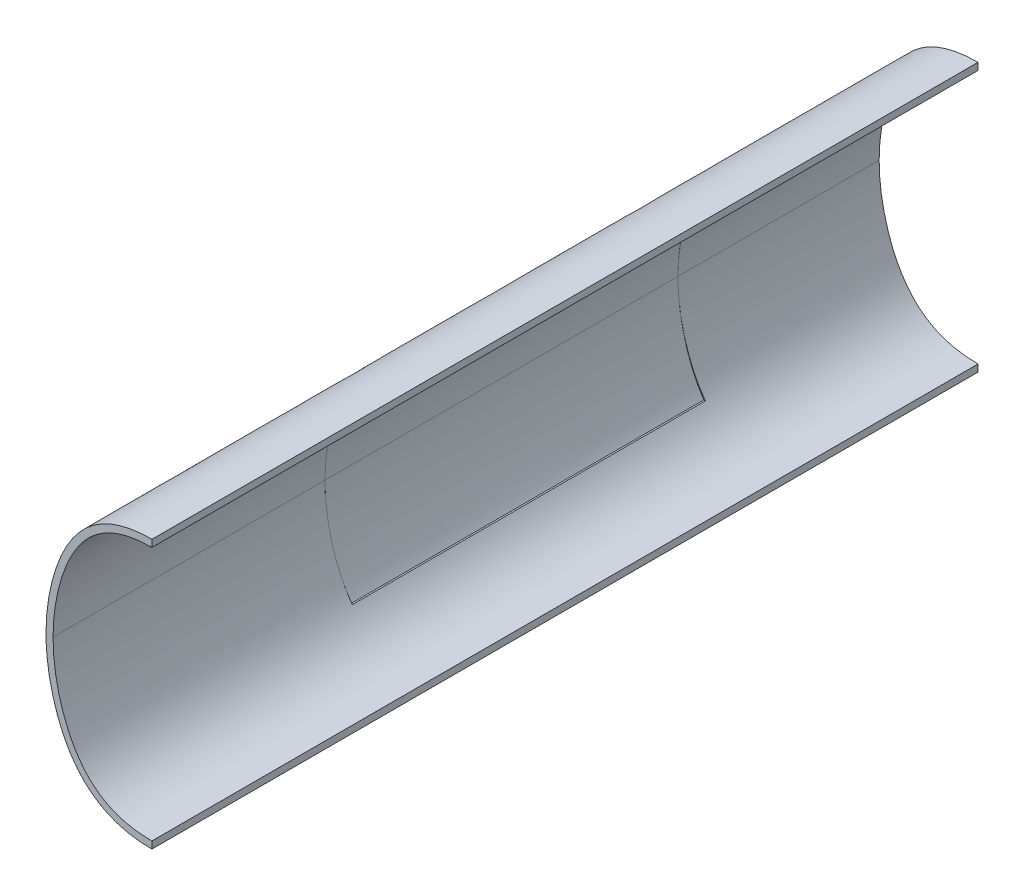
ISO-10303-21;
HEADER;
FILE_DESCRIPTION(('STEP AP214'),'2;1');
FILE_NAME('part.step','',(''),(''),'','','');
FILE_SCHEMA(('AUTOMOTIVE_DESIGN { 1 0 10303 214 1 1 1 1 }'));
ENDSEC;
DATA;
#1=APPLICATION_CONTEXT('core data for automotive mechanical design processes');
#2=APPLICATION_PROTOCOL_DEFINITION('international standard','automotive_design',2000,#1);
#3=PRODUCT_CONTEXT('',#1,'mechanical');
#4=PRODUCT('Part','Part','',(#3));
#5=PRODUCT_RELATED_PRODUCT_CATEGORY('part','',(#4));
#6=PRODUCT_DEFINITION_FORMATION('','',#4);
#7=PRODUCT_DEFINITION_CONTEXT('part definition',#1,'design');
#8=PRODUCT_DEFINITION('design','',#6,#7);
#9=PRODUCT_DEFINITION_SHAPE('','',#8);
#10=(LENGTH_UNIT() NAMED_UNIT(*) SI_UNIT(.MILLI.,.METRE.));
#11=(NAMED_UNIT(*) PLANE_ANGLE_UNIT() SI_UNIT($,.RADIAN.));
#12=(NAMED_UNIT(*) SI_UNIT($,.STERADIAN.) SOLID_ANGLE_UNIT());
#13=UNCERTAINTY_MEASURE_WITH_UNIT(LENGTH_MEASURE(1.E-05),#10,'distance_accuracy_value','');
#14=(GEOMETRIC_REPRESENTATION_CONTEXT(3) GLOBAL_UNCERTAINTY_ASSIGNED_CONTEXT((#13)) GLOBAL_UNIT_ASSIGNED_CONTEXT((#10,
#11,#12)) REPRESENTATION_CONTEXT('',''));
#15=CARTESIAN_POINT('',(0.,0.,0.));
#16=DIRECTION('',(0.,0.,1.));
#17=DIRECTION('',(1.,0.,0.));
#18=AXIS2_PLACEMENT_3D('',#15,#16,#17);
#19=CARTESIAN_POINT('',(-125.,0.,140.));
#20=CARTESIAN_POINT('',(-125.,20.4980083685293,140.));
#21=CARTESIAN_POINT('',(-118.023084898436,36.9930136098683,140.));
#22=CARTESIAN_POINT('',(-110.715171183919,57.,140.));
#23=CARTESIAN_POINT('',(-80.,57.,140.));
#24=B_SPLINE_CURVE_WITH_KNOTS('',4,(#19,#20,#21,#22,#23),.UNSPECIFIED.,.F.,.F.,(5,5),(0.,1.),.UNSPECIFIED.);
#25=DIRECTION('',(0.,0.,-1.));
#26=VECTOR('',#25,1.);
#27=SURFACE_OF_LINEAR_EXTRUSION('',#24,#26);
#28=DIRECTION('',(0.,0.,-1.));
#29=VECTOR('',#28,1.);
#30=CARTESIAN_POINT('',(-125.,0.,140.));
#31=LINE('',#30,#29);
#32=CARTESIAN_POINT('',(-125.,0.,175.5));
#33=VERTEX_POINT('',#32);
#34=CARTESIAN_POINT('',(-125.,0.,-175.5));
#35=VERTEX_POINT('',#34);
#36=EDGE_CURVE('E392',#33,#35,#31,.T.);
#37=ORIENTED_EDGE('',*,*,#36,.F.);
#38=CARTESIAN_POINT('',(-125.,0.,175.5));
#39=CARTESIAN_POINT('',(-125.000021905957,0.88412495725523,175.5));
#40=CARTESIAN_POINT('',(-124.985396659929,1.76823988011449,175.5));
#41=CARTESIAN_POINT('',(-124.927153725745,3.53610800996547,175.5));
#42=CARTESIAN_POINT('',(-124.883516647795,4.4198605792527,175.5));
#43=CARTESIAN_POINT('',(-124.767521915685,6.18594603403943,175.5));
#44=CARTESIAN_POINT('',(-124.695149010556,7.06827791546259,175.5));
#45=CARTESIAN_POINT('',(-124.522051194296,8.83047930563684,175.5));
#46=CARTESIAN_POINT('',(-124.421315919242,9.71034779531907,175.5));
#47=CARTESIAN_POINT('',(-124.191840615575,11.4665774637001,175.5));
#48=CARTESIAN_POINT('',(-124.063095742492,12.3429380089378,175.5));
#49=CARTESIAN_POINT('',(-123.775801017414,14.1037238194357,175.5));
#50=CARTESIAN_POINT('',(-123.616848556384,14.9880834195816,175.5));
#51=CARTESIAN_POINT('',(-123.270463816436,16.751116940104,175.5));
#52=CARTESIAN_POINT('',(-123.083034405673,17.6297914237947,175.5));
#53=CARTESIAN_POINT('',(-122.679522563988,19.3803445072033,175.5));
#54=CARTESIAN_POINT('',(-122.463446322599,20.2522245319912,175.5));
#55=CARTESIAN_POINT('',(-122.00215504294,21.987995860548,175.5));
#56=CARTESIAN_POINT('',(-121.756947939606,22.8518892709965,175.5));
#57=CARTESIAN_POINT('',(-121.236532873307,24.5704252174842,175.5));
#58=CARTESIAN_POINT('',(-120.961331218873,25.4250696573818,175.5));
#59=CARTESIAN_POINT('',(-120.452294707547,26.9115349975291,175.5));
#60=CARTESIAN_POINT('',(-120.225292345231,27.5457015435355,175.5));
#61=CARTESIAN_POINT('',(-119.75305317457,28.8071229521,175.5));
#62=CARTESIAN_POINT('',(-119.507818943831,29.4343787773469,175.5));
#63=CARTESIAN_POINT('',(-118.998344975042,30.6810854913774,175.5));
#64=CARTESIAN_POINT('',(-118.734106516961,31.3005369025057,175.5));
#65=CARTESIAN_POINT('',(-118.185702609543,32.5306910474586,175.5));
#66=CARTESIAN_POINT('',(-117.90153395468,33.1413923548264,175.5));
#67=CARTESIAN_POINT('',(-117.313229846686,34.3509068045039,175.5));
#68=CARTESIAN_POINT('',(-117.009155341077,34.9497495383415,175.5));
#69=CARTESIAN_POINT('',(-116.379291347667,36.1359809229719,175.5));
#70=CARTESIAN_POINT('',(-116.053500317411,36.7233687563222,175.5));
#71=CARTESIAN_POINT('',(-115.379279480129,37.8849016102102,175.5));
#72=CARTESIAN_POINT('',(-115.030853438759,38.4590488120903,175.5));
#73=CARTESIAN_POINT('',(-114.310390053749,39.592277664032,175.5));
#74=CARTESIAN_POINT('',(-113.938355131017,40.1513608504427,175.5));
#75=CARTESIAN_POINT('',(-113.152408320626,41.2773294961636,175.5));
#76=CARTESIAN_POINT('',(-112.737363906449,41.843426579539,175.5));
#77=CARTESIAN_POINT('',(-111.879742484711,42.9543338139712,175.5));
#78=CARTESIAN_POINT('',(-111.437167777736,43.4991457375584,175.5));
#79=CARTESIAN_POINT('',(-110.523973904608,44.5647633733149,175.5));
#80=CARTESIAN_POINT('',(-110.053355404172,45.0855696548222,175.5));
#81=CARTESIAN_POINT('',(-109.085326142833,46.0989354165096,175.5));
#82=CARTESIAN_POINT('',(-108.587993544078,46.5915694344624,175.5));
#83=CARTESIAN_POINT('',(-107.565710958554,47.5474009012903,175.5));
#84=CARTESIAN_POINT('',(-107.040759429389,48.0105967029718,175.5));
#85=CARTESIAN_POINT('',(-105.964228354557,48.9049063431717,175.5));
#86=CARTESIAN_POINT('',(-105.412650317002,49.3360219951859,175.5));
#87=CARTESIAN_POINT('',(-104.282182238455,50.1655236867964,175.5));
#88=CARTESIAN_POINT('',(-103.703196878404,50.5637799093767,175.5));
#89=CARTESIAN_POINT('',(-102.521808687751,51.3239994677627,175.5));
#90=CARTESIAN_POINT('',(-101.919404113041,51.6859600932992,175.5));
#91=CARTESIAN_POINT('',(-100.693643642394,52.3723857826608,175.5));
#92=CARTESIAN_POINT('',(-100.070288609451,52.6968523885042,175.5));
#93=CARTESIAN_POINT('',(-98.8019766290414,53.3094060214475,175.5));
#94=CARTESIAN_POINT('',(-98.1569242861535,53.597295308866,175.5));
#95=CARTESIAN_POINT('',(-96.8511130820279,54.1348887912943,175.5));
#96=CARTESIAN_POINT('',(-96.1903537615974,54.3845918683417,175.5));
#97=CARTESIAN_POINT('',(-94.8559749373416,54.846554996168,175.5));
#98=CARTESIAN_POINT('',(-94.1823568108767,55.058819032534,175.5));
#99=CARTESIAN_POINT('',(-92.9536295290234,55.4103525432984,175.5));
#100=CARTESIAN_POINT('',(-92.4002811862601,55.5558304738694,175.5));
#101=CARTESIAN_POINT('',(-91.2880661692533,55.8239223329893,175.5));
#102=CARTESIAN_POINT('',(-90.7291993775877,55.946535773916,175.5));
#103=CARTESIAN_POINT('',(-89.6069509337732,56.1698908286375,175.5));
#104=CARTESIAN_POINT('',(-89.0435679360075,56.2706256518717,175.5));
#105=CARTESIAN_POINT('',(-87.9132782562355,56.4512502477082,175.5));
#106=CARTESIAN_POINT('',(-87.3463703902539,56.5311325803773,175.5));
#107=CARTESIAN_POINT('',(-86.2157673562683,56.6703915443754,175.5));
#108=CARTESIAN_POINT('',(-85.6520961329945,56.7299637956756,175.5));
#109=CARTESIAN_POINT('',(-84.5232507890276,56.8307354886724,175.5));
#110=CARTESIAN_POINT('',(-83.9580770303026,56.8719390118989,175.5));
#111=CARTESIAN_POINT('',(-82.8272014732656,56.9370145697491,175.5));
#112=CARTESIAN_POINT('',(-82.2615004601285,56.9609004556315,175.5));
#113=CARTESIAN_POINT('',(-81.1305219729804,56.9923769822036,175.5));
#114=CARTESIAN_POINT('',(-80.5652452110013,56.9999929376814,175.5));
#115=CARTESIAN_POINT('',(-80.,57.,175.5));
#116=B_SPLINE_CURVE_WITH_KNOTS('',3,(#38,#39,#40,#41,#42,#43,#44,#45,#46,#47,#48,#49,#50,#51,
#52,#53,#54,#55,#56,#57,#58,#59,#60,#61,#62,#63,#64,#65,#66,#67,#68,#69,#70,#71,#72,#73,#74,#75,
#76,#77,#78,#79,#80,#81,#82,#83,#84,#85,#86,#87,#88,#89,#90,#91,#92,#93,#94,#95,#96,#97,#98,#99,
#100,#101,#102,#103,#104,#105,#106,#107,#108,#109,#110,#111,#112,#113,#114,#115),.UNSPECIFIED.,
.F.,.F.,(4,2,2,2,2,2,2,2,2,2,2,2,2,2,2,2,2,2,2,2,2,2,2,2,2,2,2,2,2,2,2,2,2,2,2,2,2,2,4),(0.,
2.65223864943779,5.30625168296547,7.96167516823353,10.6180702367655,13.2749251143878,
15.9700502958243,18.6649042082795,21.359176807443,24.0527171909762,26.7456921514531,
28.7661489704064,30.7863206801265,32.8063564549349,34.8267178760649,36.8411591485508,
38.8557436530273,40.8699938566751,42.8840378473356,44.9890604975232,47.0939074758028,
49.1987045080554,51.2976471603932,53.3967071543018,55.4956483977422,57.6025200888406,
59.709548987548,61.8164911995212,63.9343785022772,66.0523277977112,68.1700514897977,
69.886026281633,71.6020376652233,73.3185808959264,75.0357357353617,76.7358505589301,
78.4355874285956,80.1339632842798,81.8296946644076),.UNSPECIFIED.);
#117=CARTESIAN_POINT('',(-80.,57.,175.5));
#118=VERTEX_POINT('',#117);
#119=EDGE_CURVE('E348',#33,#118,#116,.T.);
#120=ORIENTED_EDGE('',*,*,#119,.T.);
#121=DIRECTION('',(0.,0.,-1.));
#122=VECTOR('',#121,1.);
#123=CARTESIAN_POINT('',(-80.,57.,140.));
#124=LINE('',#123,#122);
#125=CARTESIAN_POINT('',(-80.,57.,-175.5));
#126=VERTEX_POINT('',#125);
#127=EDGE_CURVE('E389',#118,#126,#124,.T.);
#128=ORIENTED_EDGE('',*,*,#127,.T.);
#129=CARTESIAN_POINT('',(-125.,0.,-175.5));
#130=CARTESIAN_POINT('',(-125.,20.4980083685293,-175.5));
#131=CARTESIAN_POINT('',(-118.023084898436,36.9930136098683,-175.5));
#132=CARTESIAN_POINT('',(-110.715171183919,57.,-175.5));
#133=CARTESIAN_POINT('',(-80.,57.,-175.5));
#134=B_SPLINE_CURVE_WITH_KNOTS('',4,(#129,#130,#131,#132,#133),.UNSPECIFIED.,.F.,.F.,(5,5),(0.,
1.),.UNSPECIFIED.);
#135=EDGE_CURVE('E285',#35,#126,#134,.T.);
#136=ORIENTED_EDGE('',*,*,#135,.F.);
#137=EDGE_LOOP('',(#37,#120,#128,#136));
#138=FACE_BOUND('',#137,.T.);
#139=ADVANCED_FACE('F38',(#138),#27,.T.);
#140=CARTESIAN_POINT('',(115.999949632893,-36.809382195833,175.5));
#141=DIRECTION('',(0.,0.,-1.));
#142=DIRECTION('',(-1.,0.,0.));
#143=AXIS2_PLACEMENT_3D('',#140,#141,#142);
#144=PLANE('',#143);
#145=CARTESIAN_POINT('',(-80.,54.,175.5));
#146=CARTESIAN_POINT('',(-84.874930893814,54.,175.5));
#147=CARTESIAN_POINT('',(-88.983824843489,53.4086746793709,175.5));
#148=CARTESIAN_POINT('',(-94.2934859206099,51.9146450933876,175.5));
#149=CARTESIAN_POINT('',(-95.9213280057517,51.3146447513835,175.5));
#150=CARTESIAN_POINT('',(-98.9407493786021,49.9446031817335,175.5));
#151=CARTESIAN_POINT('',(-100.332473442126,49.1744868527528,175.5));
#152=CARTESIAN_POINT('',(-102.921509381826,47.4891856345442,175.5));
#153=CARTESIAN_POINT('',(-104.118858714764,46.5738644087914,175.5));
#154=CARTESIAN_POINT('',(-106.35165180192,44.6175868515967,175.5));
#155=CARTESIAN_POINT('',(-107.387031345074,43.5765434502416,175.5));
#156=CARTESIAN_POINT('',(-110.285874467775,40.2913945588537,175.5));
#157=CARTESIAN_POINT('',(-111.943828956462,37.88564685075,175.5));
#158=CARTESIAN_POINT('',(-114.834227827324,32.7780606729056,175.5));
#159=CARTESIAN_POINT('',(-116.065931680565,30.0772521284996,175.5));
#160=CARTESIAN_POINT('',(-118.174928997309,24.4868468848606,175.5));
#161=CARTESIAN_POINT('',(-119.052306997594,21.5977641807771,175.5));
#162=CARTESIAN_POINT('',(-120.481395371989,15.6836409951729,175.5));
#163=CARTESIAN_POINT('',(-121.033233095635,12.6588725326172,175.5));
#164=CARTESIAN_POINT('',(-121.792444122015,6.46128802269029,175.5));
#165=CARTESIAN_POINT('',(-122.,3.28869583185754,175.5));
#166=CARTESIAN_POINT('',(-122.,0.,175.5));
#167=B_SPLINE_CURVE_WITH_KNOTS('',3,(#145,#146,#147,#148,#149,#150,#151,#152,#153,#154,#155,
#156,#157,#158,#159,#160,#161,#162,#163,#164,#165,#166),.UNSPECIFIED.,.F.,.F.,(4,2,2,2,2,2,2,2,
2,2,4),(0.,0.125,0.1875,0.25,0.3125,0.375,0.5,0.625,0.75,0.875,1.),.UNSPECIFIED.);
#168=CARTESIAN_POINT('',(-122.,0.,175.5));
#169=VERTEX_POINT('',#168);
#170=CARTESIAN_POINT('',(-80.,54.,175.5));
#171=VERTEX_POINT('',#170);
#172=EDGE_CURVE('E268',#169,#171,#167,.F.);
#173=ORIENTED_EDGE('',*,*,#172,.T.);
#174=DIRECTION('',(0.,1.,0.));
#175=VECTOR('',#174,1.);
#176=CARTESIAN_POINT('',(-80.,-36.809382195833,175.5));
#177=LINE('',#176,#175);
#178=EDGE_CURVE('E364',#171,#118,#177,.T.);
#179=ORIENTED_EDGE('',*,*,#178,.T.);
#180=ORIENTED_EDGE('',*,*,#119,.F.);
#181=CARTESIAN_POINT('',(-80.,-57.,175.5));
#182=CARTESIAN_POINT('',(-80.5755602355101,-56.999992440315,175.5));
#183=CARTESIAN_POINT('',(-81.1511544604504,-56.9920962045595,175.5));
#184=CARTESIAN_POINT('',(-82.3027707163957,-56.9594414887975,175.5));
#185=CARTESIAN_POINT('',(-82.8787919832119,-56.934656347354,175.5));
#186=CARTESIAN_POINT('',(-84.0302589728295,-56.8671051108776,175.5));
#187=CARTESIAN_POINT('',(-84.6057038630692,-56.824324605364,175.5));
#188=CARTESIAN_POINT('',(-85.7549886351698,-56.7196621923181,175.5));
#189=CARTESIAN_POINT('',(-86.3288281507797,-56.6577762359066,175.5));
#190=CARTESIAN_POINT('',(-87.4802380038372,-56.5130016340427,175.5));
#191=CARTESIAN_POINT('',(-88.0577805895753,-56.429890876115,175.5));
#192=CARTESIAN_POINT('',(-89.2091189838251,-56.2418997181837,175.5));
#193=CARTESIAN_POINT('',(-89.7829160398802,-56.1370269929438,175.5));
#194=CARTESIAN_POINT('',(-90.9257124340834,-55.9044297264416,175.5));
#195=CARTESIAN_POINT('',(-91.4947130517793,-55.7767114956028,175.5));
#196=CARTESIAN_POINT('',(-92.6268724159215,-55.4973844391691,175.5));
#197=CARTESIAN_POINT('',(-93.1900308194494,-55.3457742195572,175.5));
#198=CARTESIAN_POINT('',(-94.3152646118441,-55.0159810576199,175.5));
#199=CARTESIAN_POINT('',(-94.8772599128702,-54.8375241041102,175.5));
#200=CARTESIAN_POINT('',(-95.992443305179,-54.4545267205077,175.5));
#201=CARTESIAN_POINT('',(-96.5456294874765,-54.2499807210203,175.5));
#202=CARTESIAN_POINT('',(-97.6414570879943,-53.8143491685895,175.5));
#203=CARTESIAN_POINT('',(-98.1840986806204,-53.5832640550364,175.5));
#204=CARTESIAN_POINT('',(-99.2571970426202,-53.0943497725944,175.5));
#205=CARTESIAN_POINT('',(-99.7876540681582,-52.8365211665816,175.5));
#206=CARTESIAN_POINT('',(-100.831565837115,-52.2958913464075,175.5));
#207=CARTESIAN_POINT('',(-101.345104974294,-52.0132531780993,175.5));
#208=CARTESIAN_POINT('',(-102.357111558487,-51.4220722581378,175.5));
#209=CARTESIAN_POINT('',(-102.855577764427,-51.1135273812359,175.5));
#210=CARTESIAN_POINT('',(-103.836017298633,-50.4713228034252,175.5));
#211=CARTESIAN_POINT('',(-104.317991526241,-50.1376644751904,175.5));
#212=CARTESIAN_POINT('',(-105.264238544751,-49.4463240706627,175.5));
#213=CARTESIAN_POINT('',(-105.72851502134,-49.088647039767,175.5));
#214=CARTESIAN_POINT('',(-106.570830890492,-48.405442295238,175.5));
#215=CARTESIAN_POINT('',(-106.951421695139,-48.0830515584701,175.5));
#216=CARTESIAN_POINT('',(-107.698834237263,-47.422628466892,175.5));
#217=CARTESIAN_POINT('',(-108.065654841856,-47.0845948302158,175.5));
#218=CARTESIAN_POINT('',(-108.785145416746,-46.3939542863389,175.5));
#219=CARTESIAN_POINT('',(-109.137818574512,-46.041350698557,175.5));
#220=CARTESIAN_POINT('',(-109.828992356071,-45.3224959956747,175.5));
#221=CARTESIAN_POINT('',(-110.167491684014,-44.9562436384882,175.5));
#222=CARTESIAN_POINT('',(-111.163493457125,-43.8365054639208,175.5));
#223=CARTESIAN_POINT('',(-111.799618712152,-43.0638537545772,175.5));
#224=CARTESIAN_POINT('',(-113.01594369353,-41.4758191722722,175.5));
#225=CARTESIAN_POINT('',(-113.596134404426,-40.6604294434389,175.5));
#226=CARTESIAN_POINT('',(-114.594082419832,-39.1583342016911,175.5));
#227=CARTESIAN_POINT('',(-115.02133223914,-38.4778939448455,175.5));
#228=CARTESIAN_POINT('',(-115.8431188209,-37.097263745601,175.5));
#229=CARTESIAN_POINT('',(-116.23764461636,-36.3970672867084,175.5));
#230=CARTESIAN_POINT('',(-116.995666255407,-34.9797774441466,175.5));
#231=CARTESIAN_POINT('',(-117.359150034975,-34.2626776281448,175.5));
#232=CARTESIAN_POINT('',(-118.056605509507,-32.8143113923982,175.5));
#233=CARTESIAN_POINT('',(-118.390577504304,-32.0830451166729,175.5));
#234=CARTESIAN_POINT('',(-119.031778307436,-30.6056782819398,175.5));
#235=CARTESIAN_POINT('',(-119.338903111505,-29.8595326917541,175.5));
#236=CARTESIAN_POINT('',(-119.926338735485,-28.3570481599689,175.5));
#237=CARTESIAN_POINT('',(-120.206657800211,-27.6007124348025,175.5));
#238=CARTESIAN_POINT('',(-120.741782209611,-26.0791101096768,175.5));
#239=CARTESIAN_POINT('',(-120.996588273017,-25.3138437619819,175.5));
#240=CARTESIAN_POINT('',(-121.481679303024,-23.7755324529587,175.5));
#241=CARTESIAN_POINT('',(-121.711962614388,-23.0024869704038,175.5));
#242=CARTESIAN_POINT('',(-122.134842345478,-21.4990219163246,175.5));
#243=CARTESIAN_POINT('',(-122.328903418374,-20.7690133404529,175.5));
#244=CARTESIAN_POINT('',(-122.69655503518,-19.3038377482415,175.5));
#245=CARTESIAN_POINT('',(-122.870144931548,-18.5686705695045,175.5));
#246=CARTESIAN_POINT('',(-123.197097946696,-17.09381694963,175.5));
#247=CARTESIAN_POINT('',(-123.350460058286,-16.354130285374,175.5));
#248=CARTESIAN_POINT('',(-123.637043950677,-14.8708420805634,175.5));
#249=CARTESIAN_POINT('',(-123.770265083349,-14.1272404148222,175.5));
#250=CARTESIAN_POINT('',(-124.016524874472,-12.6367009586727,175.5));
#251=CARTESIAN_POINT('',(-124.129563496203,-11.8897631621973,175.5));
#252=CARTESIAN_POINT('',(-124.333935211382,-10.4031704727705,175.5));
#253=CARTESIAN_POINT('',(-124.425540074519,-9.6635529395536,175.5));
#254=CARTESIAN_POINT('',(-124.588771333516,-8.18214966423865,175.5));
#255=CARTESIAN_POINT('',(-124.66039865963,-7.44036402472445,175.5));
#256=CARTESIAN_POINT('',(-124.783446333957,-5.95517473660012,175.5));
#257=CARTESIAN_POINT('',(-124.834868240537,-5.21177121721964,175.5));
#258=CARTESIAN_POINT('',(-124.917276623345,-3.72389602543719,175.5));
#259=CARTESIAN_POINT('',(-124.948264903992,-2.97942445317111,175.5));
#260=CARTESIAN_POINT('',(-124.98963175673,-1.48997015018992,175.5));
#261=CARTESIAN_POINT('',(-125.000012000912,-0.744987465852309,175.5));
#262=CARTESIAN_POINT('',(-125.,0.,175.5));
#263=B_SPLINE_CURVE_WITH_KNOTS('',3,(#181,#182,#183,#184,#185,#186,#187,#188,#189,#190,#191,
#192,#193,#194,#195,#196,#197,#198,#199,#200,#201,#202,#203,#204,#205,#206,#207,#208,#209,#210,
#211,#212,#213,#214,#215,#216,#217,#218,#219,#220,#221,#222,#223,#224,#225,#226,#227,#228,#229,
#230,#231,#232,#233,#234,#235,#236,#237,#238,#239,#240,#241,#242,#243,#244,#245,#246,#247,#248,
#249,#250,#251,#252,#253,#254,#255,#256,#257,#258,#259,#260,#261,#262),.UNSPECIFIED.,.F.,.F.,(4,
2,2,2,2,2,2,2,2,2,2,2,2,2,2,2,2,2,2,2,2,2,2,2,2,2,2,2,2,2,2,2,2,2,2,2,2,2,2,2,4),(0.,
1.72667724663164,3.45608662262622,5.18688353417695,6.91804749300693,8.66812834150694,
10.4175930371303,12.1665752368644,13.9156595216186,15.683987954056,17.4526945166178,
19.2213718001066,20.9900118654093,22.7477928575966,24.5057181899296,26.2635475056501,
28.0210087177988,29.5169286982239,31.0129714804452,32.5086752839095,34.0045155356669,
37.004016817017,40.0040007485445,42.4134307435608,44.8236649894484,47.2348317145728,
49.6459739400854,52.0660771977577,54.4854336782375,56.9047219834766,59.3241734825274,
61.5899624484026,63.8558230661771,66.1217964639403,68.3878427643045,70.6538931873688,
72.8894313194716,75.1248653362387,77.3601269085542,79.5951910667702,81.8300738693715),.UNSPECIFIED.);
#264=CARTESIAN_POINT('',(-80.,-57.,175.5));
#265=VERTEX_POINT('',#264);
#266=EDGE_CURVE('E301',#265,#33,#263,.T.);
#267=ORIENTED_EDGE('',*,*,#266,.F.);
#268=DIRECTION('',(0.,1.,0.));
#269=VECTOR('',#268,1.);
#270=CARTESIAN_POINT('',(-80.,-36.809382195833,175.5));
#271=LINE('',#270,#269);
#272=CARTESIAN_POINT('',(-80.,-54.,175.5));
#273=VERTEX_POINT('',#272);
#274=EDGE_CURVE('E368',#265,#273,#271,.T.);
#275=ORIENTED_EDGE('',*,*,#274,.T.);
#276=CARTESIAN_POINT('',(-122.,0.,175.5));
#277=CARTESIAN_POINT('',(-122.,-3.28869583185754,175.5));
#278=CARTESIAN_POINT('',(-121.792444122015,-6.46128802269029,175.5));
#279=CARTESIAN_POINT('',(-121.033233095634,-12.6588725326172,175.5));
#280=CARTESIAN_POINT('',(-120.481395371989,-15.6836409951729,175.5));
#281=CARTESIAN_POINT('',(-119.052306997594,-21.5977641807771,175.5));
#282=CARTESIAN_POINT('',(-118.174928997309,-24.4868468848606,175.5));
#283=CARTESIAN_POINT('',(-116.065931680565,-30.0772521284996,175.5));
#284=CARTESIAN_POINT('',(-114.834227827324,-32.7780606729056,175.5));
#285=CARTESIAN_POINT('',(-111.943828956462,-37.88564685075,175.5));
#286=CARTESIAN_POINT('',(-110.285874467775,-40.2913945588537,175.5));
#287=CARTESIAN_POINT('',(-107.387031345074,-43.5765434502416,175.5));
#288=CARTESIAN_POINT('',(-106.35165180192,-44.6175868515967,175.5));
#289=CARTESIAN_POINT('',(-104.118858714764,-46.5738644087914,175.5));
#290=CARTESIAN_POINT('',(-102.921509381826,-47.4891856345442,175.5));
#291=CARTESIAN_POINT('',(-100.332473442126,-49.1744868527527,175.5));
#292=CARTESIAN_POINT('',(-98.9407493786021,-49.9446031817335,175.5));
#293=CARTESIAN_POINT('',(-95.9213280057516,-51.3146447513835,175.5));
#294=CARTESIAN_POINT('',(-94.2934859206099,-51.9146450933876,175.5));
#295=CARTESIAN_POINT('',(-88.983824843489,-53.4086746793709,175.5));
#296=CARTESIAN_POINT('',(-84.8749308938141,-54.,175.5));
#297=CARTESIAN_POINT('',(-80.,-54.,175.5));
#298=B_SPLINE_CURVE_WITH_KNOTS('',3,(#276,#277,#278,#279,#280,#281,#282,#283,#284,#285,#286,
#287,#288,#289,#290,#291,#292,#293,#294,#295,#296,#297),.UNSPECIFIED.,.F.,.F.,(4,2,2,2,2,2,2,2,
2,2,4),(0.,0.125,0.25,0.375,0.5,0.625000000000001,0.687500000000001,0.750000000000001,
0.812500000000001,0.875000000000001,1.),.UNSPECIFIED.);
#299=EDGE_CURVE('E135',#273,#169,#298,.F.);
#300=ORIENTED_EDGE('',*,*,#299,.T.);
#301=EDGE_LOOP('',(#173,#179,#180,#267,#275,#300));
#302=FACE_BOUND('',#301,.T.);
#303=ADVANCED_FACE('F40',(#302),#144,.F.);
#304=CARTESIAN_POINT('',(115.999949632893,-36.809382195833,-175.5));
#305=DIRECTION('',(0.,0.,1.));
#306=DIRECTION('',(-1.,0.,0.));
#307=AXIS2_PLACEMENT_3D('',#304,#305,#306);
#308=PLANE('',#307);
#309=ORIENTED_EDGE('',*,*,#135,.T.);
#310=DIRECTION('',(0.,1.,0.));
#311=VECTOR('',#310,1.);
#312=CARTESIAN_POINT('',(-80.,57.,-175.5));
#313=LINE('',#312,#311);
#314=CARTESIAN_POINT('',(-80.,54.,-175.5));
#315=VERTEX_POINT('',#314);
#316=EDGE_CURVE('E186',#315,#126,#313,.T.);
#317=ORIENTED_EDGE('',*,*,#316,.F.);
#318=CARTESIAN_POINT('',(-122.,0.,-175.5));
#319=CARTESIAN_POINT('',(-122.,3.28869583185754,-175.5));
#320=CARTESIAN_POINT('',(-121.792444122015,6.46128802269029,-175.5));
#321=CARTESIAN_POINT('',(-121.033233095635,12.6588725326172,-175.5));
#322=CARTESIAN_POINT('',(-120.481395371989,15.6836409951729,-175.5));
#323=CARTESIAN_POINT('',(-119.052306997594,21.5977641807771,-175.5));
#324=CARTESIAN_POINT('',(-118.174928997309,24.4868468848606,-175.5));
#325=CARTESIAN_POINT('',(-116.065931680565,30.0772521284996,-175.5));
#326=CARTESIAN_POINT('',(-114.834227827324,32.7780606729056,-175.5));
#327=CARTESIAN_POINT('',(-111.943828956462,37.88564685075,-175.5));
#328=CARTESIAN_POINT('',(-110.285874467775,40.2913945588537,-175.5));
#329=CARTESIAN_POINT('',(-107.387031345074,43.5765434502416,-175.5));
#330=CARTESIAN_POINT('',(-106.35165180192,44.6175868515967,-175.5));
#331=CARTESIAN_POINT('',(-104.118858714764,46.5738644087914,-175.5));
#332=CARTESIAN_POINT('',(-102.921509381826,47.4891856345442,-175.5));
#333=CARTESIAN_POINT('',(-100.332473442126,49.1744868527528,-175.5));
#334=CARTESIAN_POINT('',(-98.9407493786021,49.9446031817335,-175.5));
#335=CARTESIAN_POINT('',(-95.9213280057517,51.3146447513835,-175.5));
#336=CARTESIAN_POINT('',(-94.2934859206099,51.9146450933876,-175.5));
#337=CARTESIAN_POINT('',(-88.983824843489,53.4086746793709,-175.5));
#338=CARTESIAN_POINT('',(-84.874930893814,54.,-175.5));
#339=CARTESIAN_POINT('',(-80.,54.,-175.5));
#340=B_SPLINE_CURVE_WITH_KNOTS('',3,(#318,#319,#320,#321,#322,#323,#324,#325,#326,#327,#328,
#329,#330,#331,#332,#333,#334,#335,#336,#337,#338,#339),.UNSPECIFIED.,.F.,.F.,(4,2,2,2,2,2,2,2,
2,2,4),(0.,0.125,0.25,0.375,0.5,0.625,0.6875,0.75,0.8125,0.875,1.),.UNSPECIFIED.);
#341=CARTESIAN_POINT('',(-122.,0.,-175.5));
#342=VERTEX_POINT('',#341);
#343=EDGE_CURVE('E351',#315,#342,#340,.F.);
#344=ORIENTED_EDGE('',*,*,#343,.T.);
#345=CARTESIAN_POINT('',(-80.,-54.,-175.5));
#346=CARTESIAN_POINT('',(-84.8749308938141,-54.,-175.5));
#347=CARTESIAN_POINT('',(-88.983824843489,-53.4086746793709,-175.5));
#348=CARTESIAN_POINT('',(-94.2934859206099,-51.9146450933876,-175.5));
#349=CARTESIAN_POINT('',(-95.9213280057516,-51.3146447513835,-175.5));
#350=CARTESIAN_POINT('',(-98.9407493786021,-49.9446031817335,-175.5));
#351=CARTESIAN_POINT('',(-100.332473442126,-49.1744868527527,-175.5));
#352=CARTESIAN_POINT('',(-102.921509381826,-47.4891856345442,-175.5));
#353=CARTESIAN_POINT('',(-104.118858714764,-46.5738644087914,-175.5));
#354=CARTESIAN_POINT('',(-106.35165180192,-44.6175868515967,-175.5));
#355=CARTESIAN_POINT('',(-107.387031345074,-43.5765434502416,-175.5));
#356=CARTESIAN_POINT('',(-110.285874467775,-40.2913945588537,-175.5));
#357=CARTESIAN_POINT('',(-111.943828956462,-37.88564685075,-175.5));
#358=CARTESIAN_POINT('',(-114.834227827324,-32.7780606729056,-175.5));
#359=CARTESIAN_POINT('',(-116.065931680565,-30.0772521284996,-175.5));
#360=CARTESIAN_POINT('',(-118.174928997309,-24.4868468848606,-175.5));
#361=CARTESIAN_POINT('',(-119.052306997594,-21.5977641807771,-175.5));
#362=CARTESIAN_POINT('',(-120.481395371989,-15.6836409951729,-175.5));
#363=CARTESIAN_POINT('',(-121.033233095634,-12.6588725326172,-175.5));
#364=CARTESIAN_POINT('',(-121.792444122015,-6.46128802269029,-175.5));
#365=CARTESIAN_POINT('',(-122.,-3.28869583185754,-175.5));
#366=CARTESIAN_POINT('',(-122.,0.,-175.5));
#367=B_SPLINE_CURVE_WITH_KNOTS('',3,(#345,#346,#347,#348,#349,#350,#351,#352,#353,#354,#355,
#356,#357,#358,#359,#360,#361,#362,#363,#364,#365,#366),.UNSPECIFIED.,.F.,.F.,(4,2,2,2,2,2,2,2,
2,2,4),(0.,0.124999999999999,0.187499999999999,0.249999999999999,0.312499999999999,
0.374999999999999,0.5,0.625,0.75,0.875,1.),.UNSPECIFIED.);
#368=CARTESIAN_POINT('',(-80.,-54.,-175.5));
#369=VERTEX_POINT('',#368);
#370=EDGE_CURVE('E130',#342,#369,#367,.F.);
#371=ORIENTED_EDGE('',*,*,#370,.T.);
#372=DIRECTION('',(0.,1.,0.));
#373=VECTOR('',#372,1.);
#374=CARTESIAN_POINT('',(-80.,-54.,-175.5));
#375=LINE('',#374,#373);
#376=CARTESIAN_POINT('',(-80.,-57.,-175.5));
#377=VERTEX_POINT('',#376);
#378=EDGE_CURVE('E181',#377,#369,#375,.T.);
#379=ORIENTED_EDGE('',*,*,#378,.F.);
#380=CARTESIAN_POINT('',(-80.,-57.,-175.5));
#381=CARTESIAN_POINT('',(-110.715171183919,-57.,-175.5));
#382=CARTESIAN_POINT('',(-118.023084898436,-36.9930136098683,-175.5));
#383=CARTESIAN_POINT('',(-125.,-20.4980083685293,-175.5));
#384=CARTESIAN_POINT('',(-125.,0.,-175.5));
#385=B_SPLINE_CURVE_WITH_KNOTS('',4,(#380,#381,#382,#383,#384),.UNSPECIFIED.,.F.,.F.,(5,5),(0.,
1.),.UNSPECIFIED.);
#386=EDGE_CURVE('E293',#377,#35,#385,.T.);
#387=ORIENTED_EDGE('',*,*,#386,.T.);
#388=EDGE_LOOP('',(#309,#317,#344,#371,#379,#387));
#389=FACE_BOUND('',#388,.T.);
#390=ADVANCED_FACE('F321',(#389),#308,.F.);
#391=CARTESIAN_POINT('',(-80.,-57.,140.));
#392=CARTESIAN_POINT('',(-110.715171183919,-57.,140.));
#393=CARTESIAN_POINT('',(-118.023084898436,-36.9930136098683,140.));
#394=CARTESIAN_POINT('',(-125.,-20.4980083685293,140.));
#395=CARTESIAN_POINT('',(-125.,0.,140.));
#396=B_SPLINE_CURVE_WITH_KNOTS('',4,(#391,#392,#393,#394,#395),.UNSPECIFIED.,.F.,.F.,(5,5),(0.,
1.),.UNSPECIFIED.);
#397=DIRECTION('',(0.,0.,-1.));
#398=VECTOR('',#397,1.);
#399=SURFACE_OF_LINEAR_EXTRUSION('',#396,#398);
#400=ORIENTED_EDGE('',*,*,#266,.T.);
#401=ORIENTED_EDGE('',*,*,#36,.T.);
#402=ORIENTED_EDGE('',*,*,#386,.F.);
#403=DIRECTION('',(0.,0.,-1.));
#404=VECTOR('',#403,1.);
#405=CARTESIAN_POINT('',(-80.,-57.,140.));
#406=LINE('',#405,#404);
#407=EDGE_CURVE('E336',#265,#377,#406,.T.);
#408=ORIENTED_EDGE('',*,*,#407,.F.);
#409=EDGE_LOOP('',(#400,#401,#402,#408));
#410=FACE_BOUND('',#409,.T.);
#411=ADVANCED_FACE('F238',(#410),#399,.T.);
#412=CARTESIAN_POINT('',(-80.,-54.,196.5));
#413=DIRECTION('',(-1.,0.,0.));
#414=DIRECTION('',(0.,0.,1.));
#415=AXIS2_PLACEMENT_3D('',#412,#413,#414);
#416=PLANE('',#415);
#417=ORIENTED_EDGE('',*,*,#407,.T.);
#418=ORIENTED_EDGE('',*,*,#378,.T.);
#419=DIRECTION('',(0.,0.,1.));
#420=VECTOR('',#419,1.);
#421=CARTESIAN_POINT('',(-80.,-54.,81.));
#422=LINE('',#421,#420);
#423=EDGE_CURVE('E267',#369,#273,#422,.T.);
#424=ORIENTED_EDGE('',*,*,#423,.T.);
#425=ORIENTED_EDGE('',*,*,#274,.F.);
#426=EDGE_LOOP('',(#417,#418,#424,#425));
#427=FACE_BOUND('',#426,.T.);
#428=ADVANCED_FACE('F235',(#427),#416,.F.);
#429=CARTESIAN_POINT('',(-80.,-54.,15.7170566811359));
#430=CARTESIAN_POINT('',(-84.8749308938141,-54.,15.7170566811359));
#431=CARTESIAN_POINT('',(-88.983824843489,-53.4086746793709,15.7170566811359));
#432=CARTESIAN_POINT('',(-94.2934859206099,-51.9146450933876,15.7170566811359));
#433=CARTESIAN_POINT('',(-95.9213280057516,-51.3146447513835,15.7170566811359));
#434=CARTESIAN_POINT('',(-98.9407493786021,-49.9446031817335,15.7170566811359));
#435=CARTESIAN_POINT('',(-100.332473442126,-49.1744868527527,15.7170566811359));
#436=CARTESIAN_POINT('',(-102.921509381826,-47.4891856345442,15.7170566811359));
#437=CARTESIAN_POINT('',(-104.118858714764,-46.5738644087914,15.7170566811359));
#438=CARTESIAN_POINT('',(-106.35165180192,-44.6175868515967,15.7170566811359));
#439=CARTESIAN_POINT('',(-107.387031345074,-43.5765434502416,15.7170566811359));
#440=CARTESIAN_POINT('',(-110.285874467775,-40.2913945588537,15.7170566811359));
#441=CARTESIAN_POINT('',(-111.943828956462,-37.88564685075,15.7170566811359));
#442=CARTESIAN_POINT('',(-114.834227827324,-32.7780606729056,15.7170566811359));
#443=CARTESIAN_POINT('',(-116.065931680565,-30.0772521284996,15.7170566811359));
#444=CARTESIAN_POINT('',(-118.174928997309,-24.4868468848606,15.7170566811359));
#445=CARTESIAN_POINT('',(-119.052306997594,-21.5977641807771,15.7170566811359));
#446=CARTESIAN_POINT('',(-120.481395371989,-15.6836409951729,15.7170566811359));
#447=CARTESIAN_POINT('',(-121.033233095634,-12.6588725326172,15.7170566811359));
#448=CARTESIAN_POINT('',(-121.792444122015,-6.46128802269029,15.7170566811359));
#449=CARTESIAN_POINT('',(-122.,-3.28869583185754,15.7170566811359));
#450=CARTESIAN_POINT('',(-122.,0.,15.7170566811359));
#451=B_SPLINE_CURVE_WITH_KNOTS('',3,(#429,#430,#431,#432,#433,#434,#435,#436,#437,#438,#439,
#440,#441,#442,#443,#444,#445,#446,#447,#448,#449,#450),.UNSPECIFIED.,.F.,.F.,(4,2,2,2,2,2,2,2,
2,2,4),(0.,0.124999999999999,0.187499999999999,0.249999999999999,0.312499999999999,
0.374999999999999,0.5,0.625,0.75,0.875,1.),.UNSPECIFIED.);
#452=DIRECTION('',(0.,0.,1.));
#453=VECTOR('',#452,1.);
#454=SURFACE_OF_LINEAR_EXTRUSION('',#451,#453);
#455=ORIENTED_EDGE('',*,*,#299,.F.);
#456=ORIENTED_EDGE('',*,*,#423,.F.);
#457=ORIENTED_EDGE('',*,*,#370,.F.);
#458=DIRECTION('',(0.,0.,-1.));
#459=VECTOR('',#458,1.);
#460=CARTESIAN_POINT('',(-122.,0.,-15.7170566811359));
#461=LINE('',#460,#459);
#462=CARTESIAN_POINT('',(-122.,0.,-90.));
#463=VERTEX_POINT('',#462);
#464=EDGE_CURVE('E125',#463,#342,#461,.T.);
#465=ORIENTED_EDGE('',*,*,#464,.F.);
#466=CARTESIAN_POINT('',(-80.,-54.,-90.));
#467=CARTESIAN_POINT('',(-84.8749308938141,-54.,-90.));
#468=CARTESIAN_POINT('',(-88.983824843489,-53.4086746793709,-90.));
#469=CARTESIAN_POINT('',(-94.2934859206099,-51.9146450933876,-90.));
#470=CARTESIAN_POINT('',(-95.9213280057516,-51.3146447513835,-90.));
#471=CARTESIAN_POINT('',(-98.9407493786021,-49.9446031817335,-90.));
#472=CARTESIAN_POINT('',(-100.332473442126,-49.1744868527527,-90.));
#473=CARTESIAN_POINT('',(-102.921509381826,-47.4891856345442,-90.));
#474=CARTESIAN_POINT('',(-104.118858714764,-46.5738644087914,-90.));
#475=CARTESIAN_POINT('',(-106.35165180192,-44.6175868515967,-90.));
#476=CARTESIAN_POINT('',(-107.387031345074,-43.5765434502416,-90.));
#477=CARTESIAN_POINT('',(-110.285874467775,-40.2913945588537,-90.));
#478=CARTESIAN_POINT('',(-111.943828956462,-37.88564685075,-90.));
#479=CARTESIAN_POINT('',(-114.834227827324,-32.7780606729056,-90.));
#480=CARTESIAN_POINT('',(-116.065931680565,-30.0772521284996,-90.));
#481=CARTESIAN_POINT('',(-118.174928997309,-24.4868468848606,-90.));
#482=CARTESIAN_POINT('',(-119.052306997594,-21.5977641807771,-90.));
#483=CARTESIAN_POINT('',(-120.481395371989,-15.6836409951729,-90.));
#484=CARTESIAN_POINT('',(-121.033233095634,-12.6588725326172,-90.));
#485=CARTESIAN_POINT('',(-121.792444122015,-6.46128802269029,-90.));
#486=CARTESIAN_POINT('',(-122.,-3.28869583185754,-90.));
#487=CARTESIAN_POINT('',(-122.,0.,-90.));
#488=B_SPLINE_CURVE_WITH_KNOTS('',3,(#466,#467,#468,#469,#470,#471,#472,#473,#474,#475,#476,
#477,#478,#479,#480,#481,#482,#483,#484,#485,#486,#487),.UNSPECIFIED.,.F.,.F.,(4,2,2,2,2,2,2,2,
2,2,4),(0.,0.124999999999999,0.187499999999999,0.249999999999999,0.312499999999999,
0.374999999999999,0.5,0.625,0.75,0.875,1.),.UNSPECIFIED.);
#489=CARTESIAN_POINT('',(-110.363044156828,-40.,-90.));
#490=VERTEX_POINT('',#489);
#491=EDGE_CURVE('E59',#463,#490,#488,.F.);
#492=ORIENTED_EDGE('',*,*,#491,.T.);
#493=DIRECTION('',(0.,0.,1.));
#494=VECTOR('',#493,1.);
#495=CARTESIAN_POINT('',(-110.363044156828,-40.,15.7170566811359));
#496=LINE('',#495,#494);
#497=CARTESIAN_POINT('',(-110.363044156828,-40.,60.));
#498=VERTEX_POINT('',#497);
#499=EDGE_CURVE('E145',#498,#490,#496,.F.);
#500=ORIENTED_EDGE('',*,*,#499,.F.);
#501=CARTESIAN_POINT('',(-80.,-54.,60.));
#502=CARTESIAN_POINT('',(-84.8749308938141,-54.,60.));
#503=CARTESIAN_POINT('',(-88.983824843489,-53.4086746793709,60.));
#504=CARTESIAN_POINT('',(-94.2934859206099,-51.9146450933876,60.));
#505=CARTESIAN_POINT('',(-95.9213280057516,-51.3146447513835,60.));
#506=CARTESIAN_POINT('',(-98.9407493786021,-49.9446031817335,60.));
#507=CARTESIAN_POINT('',(-100.332473442126,-49.1744868527527,60.));
#508=CARTESIAN_POINT('',(-102.921509381826,-47.4891856345442,60.));
#509=CARTESIAN_POINT('',(-104.118858714764,-46.5738644087914,60.));
#510=CARTESIAN_POINT('',(-106.35165180192,-44.6175868515967,60.));
#511=CARTESIAN_POINT('',(-107.387031345074,-43.5765434502416,60.));
#512=CARTESIAN_POINT('',(-110.285874467775,-40.2913945588537,60.));
#513=CARTESIAN_POINT('',(-111.943828956462,-37.88564685075,60.));
#514=CARTESIAN_POINT('',(-114.834227827324,-32.7780606729056,60.));
#515=CARTESIAN_POINT('',(-116.065931680565,-30.0772521284996,60.));
#516=CARTESIAN_POINT('',(-118.174928997309,-24.4868468848606,60.));
#517=CARTESIAN_POINT('',(-119.052306997594,-21.5977641807771,60.));
#518=CARTESIAN_POINT('',(-120.481395371989,-15.6836409951729,60.));
#519=CARTESIAN_POINT('',(-121.033233095634,-12.6588725326172,60.));
#520=CARTESIAN_POINT('',(-121.792444122015,-6.46128802269029,60.));
#521=CARTESIAN_POINT('',(-122.,-3.28869583185754,60.));
#522=CARTESIAN_POINT('',(-122.,0.,60.));
#523=B_SPLINE_CURVE_WITH_KNOTS('',3,(#501,#502,#503,#504,#505,#506,#507,#508,#509,#510,#511,
#512,#513,#514,#515,#516,#517,#518,#519,#520,#521,#522),.UNSPECIFIED.,.F.,.F.,(4,2,2,2,2,2,2,2,
2,2,4),(0.,0.124999999999999,0.187499999999999,0.249999999999999,0.312499999999999,
0.374999999999999,0.5,0.625,0.75,0.875,1.),.UNSPECIFIED.);
#524=CARTESIAN_POINT('',(-122.,0.,60.0000000000001));
#525=VERTEX_POINT('',#524);
#526=EDGE_CURVE('E158',#498,#525,#523,.T.);
#527=ORIENTED_EDGE('',*,*,#526,.T.);
#528=DIRECTION('',(0.,0.,1.));
#529=VECTOR('',#528,1.);
#530=CARTESIAN_POINT('',(-122.,0.,15.7170566811359));
#531=LINE('',#530,#529);
#532=EDGE_CURVE('E263',#525,#169,#531,.T.);
#533=ORIENTED_EDGE('',*,*,#532,.T.);
#534=EDGE_LOOP('',(#455,#456,#457,#465,#492,#500,#527,#533));
#535=FACE_BOUND('',#534,.T.);
#536=ADVANCED_FACE('F128',(#535),#454,.T.);
#537=CARTESIAN_POINT('',(-80.,57.,196.5));
#538=DIRECTION('',(-1.,0.,0.));
#539=DIRECTION('',(0.,0.,1.));
#540=AXIS2_PLACEMENT_3D('',#537,#538,#539);
#541=PLANE('',#540);
#542=ORIENTED_EDGE('',*,*,#178,.F.);
#543=DIRECTION('',(0.,0.,1.));
#544=VECTOR('',#543,1.);
#545=CARTESIAN_POINT('',(-80.,54.,81.));
#546=LINE('',#545,#544);
#547=EDGE_CURVE('E272',#315,#171,#546,.T.);
#548=ORIENTED_EDGE('',*,*,#547,.F.);
#549=ORIENTED_EDGE('',*,*,#316,.T.);
#550=ORIENTED_EDGE('',*,*,#127,.F.);
#551=EDGE_LOOP('',(#542,#548,#549,#550));
#552=FACE_BOUND('',#551,.T.);
#553=ADVANCED_FACE('F231',(#552),#541,.F.);
#554=CARTESIAN_POINT('',(-122.,0.,15.7170566811359));
#555=CARTESIAN_POINT('',(-122.,3.28869583185754,15.7170566811359));
#556=CARTESIAN_POINT('',(-121.792444122015,6.46128802269029,15.7170566811359));
#557=CARTESIAN_POINT('',(-121.033233095635,12.6588725326172,15.7170566811359));
#558=CARTESIAN_POINT('',(-120.481395371989,15.6836409951729,15.7170566811359));
#559=CARTESIAN_POINT('',(-119.052306997594,21.5977641807771,15.7170566811359));
#560=CARTESIAN_POINT('',(-118.174928997309,24.4868468848606,15.7170566811359));
#561=CARTESIAN_POINT('',(-116.065931680565,30.0772521284996,15.7170566811359));
#562=CARTESIAN_POINT('',(-114.834227827324,32.7780606729056,15.7170566811359));
#563=CARTESIAN_POINT('',(-111.943828956462,37.88564685075,15.7170566811359));
#564=CARTESIAN_POINT('',(-110.285874467775,40.2913945588537,15.7170566811359));
#565=CARTESIAN_POINT('',(-107.387031345074,43.5765434502416,15.7170566811359));
#566=CARTESIAN_POINT('',(-106.35165180192,44.6175868515967,15.7170566811359));
#567=CARTESIAN_POINT('',(-104.118858714764,46.5738644087914,15.7170566811359));
#568=CARTESIAN_POINT('',(-102.921509381826,47.4891856345442,15.7170566811359));
#569=CARTESIAN_POINT('',(-100.332473442126,49.1744868527528,15.7170566811359));
#570=CARTESIAN_POINT('',(-98.9407493786021,49.9446031817335,15.7170566811359));
#571=CARTESIAN_POINT('',(-95.9213280057517,51.3146447513835,15.7170566811359));
#572=CARTESIAN_POINT('',(-94.2934859206099,51.9146450933876,15.7170566811359));
#573=CARTESIAN_POINT('',(-88.983824843489,53.4086746793709,15.7170566811359));
#574=CARTESIAN_POINT('',(-84.874930893814,54.,15.7170566811359));
#575=CARTESIAN_POINT('',(-80.,54.,15.7170566811359));
#576=B_SPLINE_CURVE_WITH_KNOTS('',3,(#554,#555,#556,#557,#558,#559,#560,#561,#562,#563,#564,
#565,#566,#567,#568,#569,#570,#571,#572,#573,#574,#575),.UNSPECIFIED.,.F.,.F.,(4,2,2,2,2,2,2,2,
2,2,4),(0.,0.125,0.25,0.375,0.5,0.625,0.6875,0.75,0.8125,0.875,1.),.UNSPECIFIED.);
#577=DIRECTION('',(0.,0.,1.));
#578=VECTOR('',#577,1.);
#579=SURFACE_OF_LINEAR_EXTRUSION('',#576,#578);
#580=ORIENTED_EDGE('',*,*,#532,.F.);
#581=CARTESIAN_POINT('',(-122.,0.,60.));
#582=CARTESIAN_POINT('',(-122.,3.28869583185754,60.));
#583=CARTESIAN_POINT('',(-121.792444122015,6.46128802269029,60.));
#584=CARTESIAN_POINT('',(-121.033233095635,12.6588725326172,60.));
#585=CARTESIAN_POINT('',(-120.481395371989,15.6836409951729,60.));
#586=CARTESIAN_POINT('',(-119.052306997594,21.5977641807771,60.));
#587=CARTESIAN_POINT('',(-118.174928997309,24.4868468848606,60.));
#588=CARTESIAN_POINT('',(-116.065931680565,30.0772521284996,60.));
#589=CARTESIAN_POINT('',(-114.834227827324,32.7780606729056,60.));
#590=CARTESIAN_POINT('',(-111.943828956462,37.88564685075,60.));
#591=CARTESIAN_POINT('',(-110.285874467775,40.2913945588537,60.));
#592=CARTESIAN_POINT('',(-107.387031345074,43.5765434502416,60.));
#593=CARTESIAN_POINT('',(-106.35165180192,44.6175868515967,60.));
#594=CARTESIAN_POINT('',(-104.118858714764,46.5738644087914,60.));
#595=CARTESIAN_POINT('',(-102.921509381826,47.4891856345442,60.));
#596=CARTESIAN_POINT('',(-100.332473442126,49.1744868527528,60.));
#597=CARTESIAN_POINT('',(-98.9407493786021,49.9446031817335,60.));
#598=CARTESIAN_POINT('',(-95.9213280057517,51.3146447513835,60.));
#599=CARTESIAN_POINT('',(-94.2934859206099,51.9146450933876,60.));
#600=CARTESIAN_POINT('',(-88.983824843489,53.4086746793709,60.));
#601=CARTESIAN_POINT('',(-84.874930893814,54.,60.));
#602=CARTESIAN_POINT('',(-80.,54.,60.));
#603=B_SPLINE_CURVE_WITH_KNOTS('',3,(#581,#582,#583,#584,#585,#586,#587,#588,#589,#590,#591,
#592,#593,#594,#595,#596,#597,#598,#599,#600,#601,#602),.UNSPECIFIED.,.F.,.F.,(4,2,2,2,2,2,2,2,
2,2,4),(0.,0.125,0.25,0.375,0.5,0.625,0.6875,0.75,0.8125,0.875,1.),.UNSPECIFIED.);
#604=CARTESIAN_POINT('',(-110.363044156828,40.,60.));
#605=VERTEX_POINT('',#604);
#606=EDGE_CURVE('E146',#525,#605,#603,.T.);
#607=ORIENTED_EDGE('',*,*,#606,.T.);
#608=DIRECTION('',(0.,0.,1.));
#609=VECTOR('',#608,1.);
#610=CARTESIAN_POINT('',(-110.363044156828,40.,15.7170566811359));
#611=LINE('',#610,#609);
#612=CARTESIAN_POINT('',(-110.363044156828,40.,-90.));
#613=VERTEX_POINT('',#612);
#614=EDGE_CURVE('E140',#613,#605,#611,.T.);
#615=ORIENTED_EDGE('',*,*,#614,.F.);
#616=CARTESIAN_POINT('',(-122.,0.,-90.));
#617=CARTESIAN_POINT('',(-122.,3.28869583185754,-90.));
#618=CARTESIAN_POINT('',(-121.792444122015,6.46128802269029,-90.));
#619=CARTESIAN_POINT('',(-121.033233095635,12.6588725326172,-90.));
#620=CARTESIAN_POINT('',(-120.481395371989,15.6836409951729,-90.));
#621=CARTESIAN_POINT('',(-119.052306997594,21.5977641807771,-90.));
#622=CARTESIAN_POINT('',(-118.174928997309,24.4868468848606,-90.));
#623=CARTESIAN_POINT('',(-116.065931680565,30.0772521284996,-90.));
#624=CARTESIAN_POINT('',(-114.834227827324,32.7780606729056,-90.));
#625=CARTESIAN_POINT('',(-111.943828956462,37.88564685075,-90.));
#626=CARTESIAN_POINT('',(-110.285874467775,40.2913945588537,-90.));
#627=CARTESIAN_POINT('',(-107.387031345074,43.5765434502416,-90.));
#628=CARTESIAN_POINT('',(-106.35165180192,44.6175868515967,-90.));
#629=CARTESIAN_POINT('',(-104.118858714764,46.5738644087914,-90.));
#630=CARTESIAN_POINT('',(-102.921509381826,47.4891856345442,-90.));
#631=CARTESIAN_POINT('',(-100.332473442126,49.1744868527528,-90.));
#632=CARTESIAN_POINT('',(-98.9407493786021,49.9446031817335,-90.));
#633=CARTESIAN_POINT('',(-95.9213280057517,51.3146447513835,-90.));
#634=CARTESIAN_POINT('',(-94.2934859206099,51.9146450933876,-90.));
#635=CARTESIAN_POINT('',(-88.983824843489,53.4086746793709,-90.));
#636=CARTESIAN_POINT('',(-84.874930893814,54.,-90.));
#637=CARTESIAN_POINT('',(-80.,54.,-90.));
#638=B_SPLINE_CURVE_WITH_KNOTS('',3,(#616,#617,#618,#619,#620,#621,#622,#623,#624,#625,#626,
#627,#628,#629,#630,#631,#632,#633,#634,#635,#636,#637),.UNSPECIFIED.,.F.,.F.,(4,2,2,2,2,2,2,2,
2,2,4),(0.,0.125,0.25,0.375,0.5,0.625,0.6875,0.75,0.8125,0.875,1.),.UNSPECIFIED.);
#639=EDGE_CURVE('E138',#613,#463,#638,.F.);
#640=ORIENTED_EDGE('',*,*,#639,.T.);
#641=ORIENTED_EDGE('',*,*,#464,.T.);
#642=ORIENTED_EDGE('',*,*,#343,.F.);
#643=ORIENTED_EDGE('',*,*,#547,.T.);
#644=ORIENTED_EDGE('',*,*,#172,.F.);
#645=EDGE_LOOP('',(#580,#607,#615,#640,#641,#642,#643,#644));
#646=FACE_BOUND('',#645,.T.);
#647=ADVANCED_FACE('F139',(#646),#579,.T.);
#648=CARTESIAN_POINT('',(129.417258247769,40.,-90.));
#649=DIRECTION('',(0.,0.,-1.));
#650=DIRECTION('',(0.,1.,0.));
#651=AXIS2_PLACEMENT_3D('',#648,#649,#650);
#652=PLANE('',#651);
#653=ORIENTED_EDGE('',*,*,#491,.F.);
#654=CARTESIAN_POINT('',(-111.034351088662,-40.,-90.));
#655=CARTESIAN_POINT('',(-116.771865737066,-31.446745908165,-90.));
#656=CARTESIAN_POINT('',(-119.888445187465,-21.3418492602764,-90.));
#657=CARTESIAN_POINT('',(-122.000000000005,-11.2766766276026,-90.));
#658=CARTESIAN_POINT('',(-122.000000000007,7.63508744412545E-13,-90.));
#659=B_SPLINE_CURVE_WITH_KNOTS('',4,(#654,#655,#656,#657,#658),.UNSPECIFIED.,.F.,.F.,(5,5),
(0.449864766134232,1.),.UNSPECIFIED.);
#660=CARTESIAN_POINT('',(-111.034351088662,-40.0000000000028,-90.));
#661=VERTEX_POINT('',#660);
#662=EDGE_CURVE('E153',#661,#463,#659,.T.);
#663=ORIENTED_EDGE('',*,*,#662,.F.);
#664=DIRECTION('',(1.,0.,0.));
#665=VECTOR('',#664,1.);
#666=CARTESIAN_POINT('',(-129.417258247769,-40.,-90.));
#667=LINE('',#666,#665);
#668=EDGE_CURVE('E155',#661,#490,#667,.T.);
#669=ORIENTED_EDGE('',*,*,#668,.T.);
#670=EDGE_LOOP('',(#653,#663,#669));
#671=FACE_BOUND('',#670,.T.);
#672=ADVANCED_FACE('F151',(#671),#652,.F.);
#673=ORIENTED_EDGE('',*,*,#639,.F.);
#674=DIRECTION('',(-1.,0.,0.));
#675=VECTOR('',#674,1.);
#676=CARTESIAN_POINT('',(129.417258247769,40.,-90.));
#677=LINE('',#676,#675);
#678=CARTESIAN_POINT('',(-111.03435108866,40.,-90.));
#679=VERTEX_POINT('',#678);
#680=EDGE_CURVE('E51',#613,#679,#677,.T.);
#681=ORIENTED_EDGE('',*,*,#680,.T.);
#682=CARTESIAN_POINT('',(-122.000000000007,7.63156510832191E-13,-90.));
#683=CARTESIAN_POINT('',(-122.000000000005,11.2766766276054,-90.));
#684=CARTESIAN_POINT('',(-119.888445187465,21.3418492602803,-90.));
#685=CARTESIAN_POINT('',(-116.771865737066,31.44674590817,-90.));
#686=CARTESIAN_POINT('',(-111.03435108866,40.0000000000056,-90.));
#687=B_SPLINE_CURVE_WITH_KNOTS('',4,(#682,#683,#684,#685,#686),.UNSPECIFIED.,.F.,.F.,(5,5),(0.,
0.55013523386583),.UNSPECIFIED.);
#688=EDGE_CURVE('E161',#463,#679,#687,.T.);
#689=ORIENTED_EDGE('',*,*,#688,.F.);
#690=EDGE_LOOP('',(#673,#681,#689));
#691=FACE_BOUND('',#690,.T.);
#692=ADVANCED_FACE('F163',(#691),#652,.F.);
#693=CARTESIAN_POINT('',(129.417258247769,-40.,60.));
#694=DIRECTION('',(0.,0.,1.));
#695=DIRECTION('',(0.,-1.,0.));
#696=AXIS2_PLACEMENT_3D('',#693,#694,#695);
#697=PLANE('',#696);
#698=ORIENTED_EDGE('',*,*,#526,.F.);
#699=DIRECTION('',(1.,0.,0.));
#700=VECTOR('',#699,1.);
#701=CARTESIAN_POINT('',(-129.417258247769,-40.,60.));
#702=LINE('',#701,#700);
#703=CARTESIAN_POINT('',(-111.034351088662,-40.,60.));
#704=VERTEX_POINT('',#703);
#705=EDGE_CURVE('E281',#704,#498,#702,.T.);
#706=ORIENTED_EDGE('',*,*,#705,.F.);
#707=CARTESIAN_POINT('',(-111.034351088662,-40.,60.));
#708=CARTESIAN_POINT('',(-116.771865737066,-31.446745908165,60.));
#709=CARTESIAN_POINT('',(-119.888445187465,-21.3418492602764,60.));
#710=CARTESIAN_POINT('',(-122.000000000005,-11.2766766276026,60.));
#711=CARTESIAN_POINT('',(-122.000000000007,7.63508744412545E-13,60.));
#712=B_SPLINE_CURVE_WITH_KNOTS('',4,(#707,#708,#709,#710,#711),.UNSPECIFIED.,.F.,.F.,(5,5),
(0.449864766134232,1.),.UNSPECIFIED.);
#713=EDGE_CURVE('E157',#704,#525,#712,.T.);
#714=ORIENTED_EDGE('',*,*,#713,.T.);
#715=EDGE_LOOP('',(#698,#706,#714));
#716=FACE_BOUND('',#715,.T.);
#717=ADVANCED_FACE('F325',(#716),#697,.F.);
#718=ORIENTED_EDGE('',*,*,#606,.F.);
#719=CARTESIAN_POINT('',(-122.000000000007,7.63156510832191E-13,60.));
#720=CARTESIAN_POINT('',(-122.000000000005,11.2766766276054,60.));
#721=CARTESIAN_POINT('',(-119.888445187465,21.3418492602803,60.));
#722=CARTESIAN_POINT('',(-116.771865737066,31.44674590817,60.));
#723=CARTESIAN_POINT('',(-111.03435108866,40.0000000000056,60.));
#724=B_SPLINE_CURVE_WITH_KNOTS('',4,(#719,#720,#721,#722,#723),.UNSPECIFIED.,.F.,.F.,(5,5),(0.,
0.55013523386583),.UNSPECIFIED.);
#725=CARTESIAN_POINT('',(-111.03435108866,40.,60.));
#726=VERTEX_POINT('',#725);
#727=EDGE_CURVE('E173',#525,#726,#724,.T.);
#728=ORIENTED_EDGE('',*,*,#727,.T.);
#729=DIRECTION('',(-1.,0.,0.));
#730=VECTOR('',#729,1.);
#731=CARTESIAN_POINT('',(129.417258247769,40.,60.));
#732=LINE('',#731,#730);
#733=EDGE_CURVE('E11',#605,#726,#732,.T.);
#734=ORIENTED_EDGE('',*,*,#733,.F.);
#735=EDGE_LOOP('',(#718,#728,#734));
#736=FACE_BOUND('',#735,.T.);
#737=ADVANCED_FACE('F457',(#736),#697,.F.);
#738=CARTESIAN_POINT('',(129.417258247769,40.,60.));
#739=DIRECTION('',(0.,1.,0.));
#740=DIRECTION('',(0.,0.,1.));
#741=AXIS2_PLACEMENT_3D('',#738,#739,#740);
#742=PLANE('',#741);
#743=ORIENTED_EDGE('',*,*,#680,.F.);
#744=ORIENTED_EDGE('',*,*,#614,.T.);
#745=ORIENTED_EDGE('',*,*,#733,.T.);
#746=DIRECTION('',(0.,0.,-1.));
#747=VECTOR('',#746,1.);
#748=CARTESIAN_POINT('',(-111.03435108866,40.0000000000056,141.209847614168));
#749=LINE('',#748,#747);
#750=EDGE_CURVE('E177',#726,#679,#749,.T.);
#751=ORIENTED_EDGE('',*,*,#750,.T.);
#752=EDGE_LOOP('',(#743,#744,#745,#751));
#753=FACE_BOUND('',#752,.T.);
#754=ADVANCED_FACE('F446',(#753),#742,.F.);
#755=CARTESIAN_POINT('',(-129.417258247769,-40.,-90.));
#756=DIRECTION('',(0.,-1.,0.));
#757=DIRECTION('',(0.,0.,-1.));
#758=AXIS2_PLACEMENT_3D('',#755,#756,#757);
#759=PLANE('',#758);
#760=ORIENTED_EDGE('',*,*,#705,.T.);
#761=ORIENTED_EDGE('',*,*,#499,.T.);
#762=ORIENTED_EDGE('',*,*,#668,.F.);
#763=DIRECTION('',(0.,0.,-1.));
#764=VECTOR('',#763,1.);
#765=CARTESIAN_POINT('',(-111.034351088662,-40.0000000000028,141.209847614168));
#766=LINE('',#765,#764);
#767=EDGE_CURVE('E167',#704,#661,#766,.T.);
#768=ORIENTED_EDGE('',*,*,#767,.F.);
#769=EDGE_LOOP('',(#760,#761,#762,#768));
#770=FACE_BOUND('',#769,.T.);
#771=ADVANCED_FACE('F230',(#770),#759,.F.);
#772=CARTESIAN_POINT('',(-122.000000000007,7.63156510832191E-13,141.209847614168));
#773=CARTESIAN_POINT('',(-122.000000000005,11.2766766276054,141.209847614168));
#774=CARTESIAN_POINT('',(-119.888445187465,21.3418492602803,141.209847614168));
#775=CARTESIAN_POINT('',(-116.771865737066,31.44674590817,141.209847614168));
#776=CARTESIAN_POINT('',(-111.03435108866,40.0000000000056,141.209847614168));
#777=B_SPLINE_CURVE_WITH_KNOTS('',4,(#772,#773,#774,#775,#776),.UNSPECIFIED.,.F.,.F.,(5,5),(0.,
0.55013523386583),.UNSPECIFIED.);
#778=DIRECTION('',(0.,0.,-1.));
#779=VECTOR('',#778,1.);
#780=SURFACE_OF_LINEAR_EXTRUSION('',#777,#779);
#781=ORIENTED_EDGE('',*,*,#727,.F.);
#782=DIRECTION('',(0.,0.,-1.));
#783=VECTOR('',#782,1.);
#784=CARTESIAN_POINT('',(-122.000000000007,7.63508744412545E-13,141.209847614168));
#785=LINE('',#784,#783);
#786=EDGE_CURVE('E168',#525,#463,#785,.T.);
#787=ORIENTED_EDGE('',*,*,#786,.T.);
#788=ORIENTED_EDGE('',*,*,#688,.T.);
#789=ORIENTED_EDGE('',*,*,#750,.F.);
#790=EDGE_LOOP('',(#781,#787,#788,#789));
#791=FACE_BOUND('',#790,.T.);
#792=ADVANCED_FACE('F172',(#791),#780,.F.);
#793=CARTESIAN_POINT('',(-111.034351088662,-40.,141.209847614168));
#794=CARTESIAN_POINT('',(-116.771865737066,-31.446745908165,141.209847614168));
#795=CARTESIAN_POINT('',(-119.888445187465,-21.3418492602764,141.209847614168));
#796=CARTESIAN_POINT('',(-122.000000000005,-11.2766766276026,141.209847614168));
#797=CARTESIAN_POINT('',(-122.000000000007,7.63508744412545E-13,141.209847614168));
#798=B_SPLINE_CURVE_WITH_KNOTS('',4,(#793,#794,#795,#796,#797),.UNSPECIFIED.,.F.,.F.,(5,5),
(0.449864766134232,1.),.UNSPECIFIED.);
#799=DIRECTION('',(0.,0.,-1.));
#800=VECTOR('',#799,1.);
#801=SURFACE_OF_LINEAR_EXTRUSION('',#798,#800);
#802=ORIENTED_EDGE('',*,*,#713,.F.);
#803=ORIENTED_EDGE('',*,*,#767,.T.);
#804=ORIENTED_EDGE('',*,*,#662,.T.);
#805=ORIENTED_EDGE('',*,*,#786,.F.);
#806=EDGE_LOOP('',(#802,#803,#804,#805));
#807=FACE_BOUND('',#806,.T.);
#808=ADVANCED_FACE('F179',(#807),#801,.F.);
#809=CLOSED_SHELL('',(#139,#303,#390,#411,#428,#536,#553,#647,#672,#692,#717,#737,#754,#771,
#792,#808));
#810=MANIFOLD_SOLID_BREP('B2',#809);
#811=ADVANCED_BREP_SHAPE_REPRESENTATION('',(#18,#810),#14);
#812=SHAPE_DEFINITION_REPRESENTATION(#9,#811);
ENDSEC;
END-ISO-10303-21;
